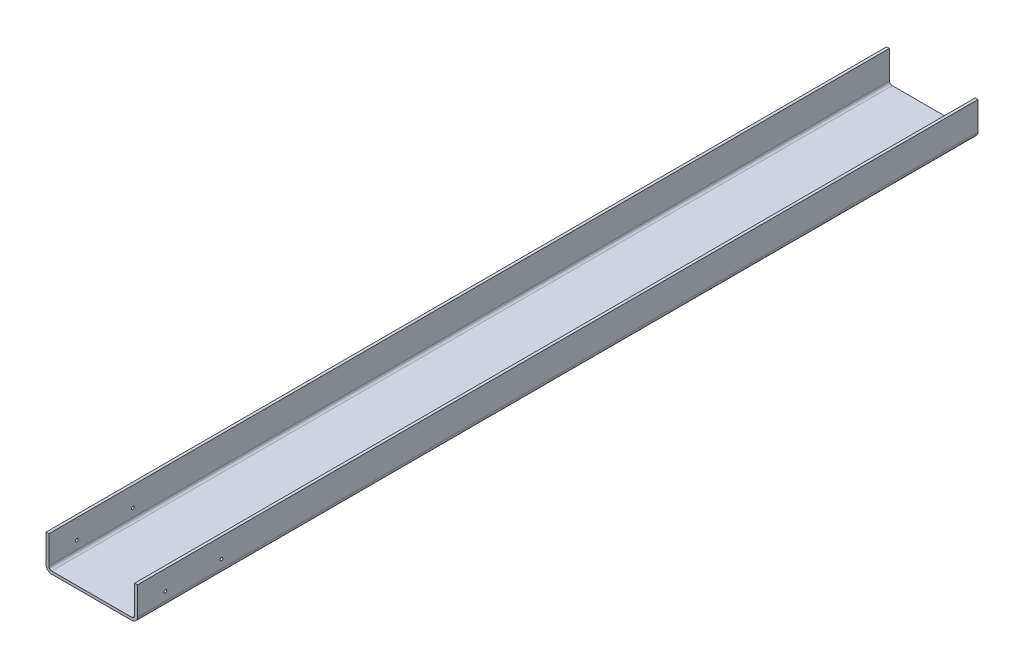
ISO-10303-21;
HEADER;
FILE_DESCRIPTION(('STEP AP214'),'2;1');
FILE_NAME('part.step','',(''),(''),'','','');
FILE_SCHEMA(('AUTOMOTIVE_DESIGN { 1 0 10303 214 1 1 1 1 }'));
ENDSEC;
DATA;
#1=APPLICATION_CONTEXT('core data for automotive mechanical design processes');
#2=APPLICATION_PROTOCOL_DEFINITION('international standard','automotive_design',2000,#1);
#3=PRODUCT_CONTEXT('',#1,'mechanical');
#4=PRODUCT('Part','Part','',(#3));
#5=PRODUCT_RELATED_PRODUCT_CATEGORY('part','',(#4));
#6=PRODUCT_DEFINITION_FORMATION('','',#4);
#7=PRODUCT_DEFINITION_CONTEXT('part definition',#1,'design');
#8=PRODUCT_DEFINITION('design','',#6,#7);
#9=PRODUCT_DEFINITION_SHAPE('','',#8);
#10=(LENGTH_UNIT() NAMED_UNIT(*) SI_UNIT(.MILLI.,.METRE.));
#11=(NAMED_UNIT(*) PLANE_ANGLE_UNIT() SI_UNIT($,.RADIAN.));
#12=(NAMED_UNIT(*) SI_UNIT($,.STERADIAN.) SOLID_ANGLE_UNIT());
#13=UNCERTAINTY_MEASURE_WITH_UNIT(LENGTH_MEASURE(1.E-05),#10,'distance_accuracy_value','');
#14=(GEOMETRIC_REPRESENTATION_CONTEXT(3) GLOBAL_UNCERTAINTY_ASSIGNED_CONTEXT((#13)) GLOBAL_UNIT_ASSIGNED_CONTEXT((#10,
#11,#12)) REPRESENTATION_CONTEXT('',''));
#15=CARTESIAN_POINT('',(0.,0.,0.));
#16=DIRECTION('',(0.,0.,1.));
#17=DIRECTION('',(1.,0.,0.));
#18=AXIS2_PLACEMENT_3D('',#15,#16,#17);
#19=CARTESIAN_POINT('',(81.5,9.99999999999998,750.));
#20=DIRECTION('',(-1.,0.,0.));
#21=DIRECTION('',(0.,0.,1.));
#22=AXIS2_PLACEMENT_3D('',#19,#20,#21);
#23=PLANE('',#22);
#24=DIRECTION('',(0.,1.,0.));
#25=VECTOR('',#24,1.);
#26=CARTESIAN_POINT('',(81.5,9.99999999999998,-750.));
#27=LINE('',#26,#25);
#28=CARTESIAN_POINT('',(81.5,9.99999999999998,-750.));
#29=VERTEX_POINT('',#28);
#30=CARTESIAN_POINT('',(81.5,60.,-750.));
#31=VERTEX_POINT('',#30);
#32=EDGE_CURVE('E109',#29,#31,#27,.T.);
#33=ORIENTED_EDGE('',*,*,#32,.T.);
#34=DIRECTION('',(0.,0.,-1.));
#35=VECTOR('',#34,1.);
#36=CARTESIAN_POINT('',(81.5,60.,750.));
#37=LINE('',#36,#35);
#38=CARTESIAN_POINT('',(81.5,60.,750.));
#39=VERTEX_POINT('',#38);
#40=EDGE_CURVE('E162',#39,#31,#37,.T.);
#41=ORIENTED_EDGE('',*,*,#40,.F.);
#42=DIRECTION('',(0.,1.,0.));
#43=VECTOR('',#42,1.);
#44=CARTESIAN_POINT('',(81.5,9.99999999999998,750.));
#45=LINE('',#44,#43);
#46=CARTESIAN_POINT('',(81.5,9.99999999999998,750.));
#47=VERTEX_POINT('',#46);
#48=EDGE_CURVE('E62',#47,#39,#45,.T.);
#49=ORIENTED_EDGE('',*,*,#48,.F.);
#50=DIRECTION('',(0.,0.,-1.));
#51=VECTOR('',#50,1.);
#52=CARTESIAN_POINT('',(81.5,9.99999999999998,750.));
#53=LINE('',#52,#51);
#54=EDGE_CURVE('E158',#47,#29,#53,.T.);
#55=ORIENTED_EDGE('',*,*,#54,.T.);
#56=EDGE_LOOP('',(#33,#41,#49,#55));
#57=FACE_BOUND('',#56,.T.);
#58=CARTESIAN_POINT('',(81.5,24.9115,700.));
#59=DIRECTION('',(1.,0.,0.));
#60=DIRECTION('',(0.,0.,-1.));
#61=AXIS2_PLACEMENT_3D('',#58,#59,#60);
#62=CIRCLE('',#61,2.5);
#63=CARTESIAN_POINT('',(81.5,24.9115,697.5));
#64=VERTEX_POINT('',#63);
#65=EDGE_CURVE('E262',#64,#64,#62,.T.);
#66=ORIENTED_EDGE('',*,*,#65,.F.);
#67=EDGE_LOOP('',(#66));
#68=FACE_BOUND('',#67,.T.);
#69=CARTESIAN_POINT('',(81.5,24.9115,600.));
#70=DIRECTION('',(1.,0.,0.));
#71=DIRECTION('',(0.,0.,-1.));
#72=AXIS2_PLACEMENT_3D('',#69,#70,#71);
#73=CIRCLE('',#72,2.5);
#74=CARTESIAN_POINT('',(81.5,24.9115,597.5));
#75=VERTEX_POINT('',#74);
#76=EDGE_CURVE('E265',#75,#75,#73,.T.);
#77=ORIENTED_EDGE('',*,*,#76,.F.);
#78=EDGE_LOOP('',(#77));
#79=FACE_BOUND('',#78,.T.);
#80=ADVANCED_FACE('F45',(#57,#68,#79),#23,.F.);
#81=CARTESIAN_POINT('',(76.5,60.,750.));
#82=DIRECTION('',(0.,-1.,0.));
#83=DIRECTION('',(0.,0.,-1.));
#84=AXIS2_PLACEMENT_3D('',#81,#82,#83);
#85=PLANE('',#84);
#86=DIRECTION('',(-1.,0.,0.));
#87=VECTOR('',#86,1.);
#88=CARTESIAN_POINT('',(76.5,60.,-750.));
#89=LINE('',#88,#87);
#90=CARTESIAN_POINT('',(76.5,60.,-750.));
#91=VERTEX_POINT('',#90);
#92=EDGE_CURVE('E166',#31,#91,#89,.T.);
#93=ORIENTED_EDGE('',*,*,#92,.T.);
#94=DIRECTION('',(0.,0.,-1.));
#95=VECTOR('',#94,1.);
#96=CARTESIAN_POINT('',(76.5,60.,750.));
#97=LINE('',#96,#95);
#98=CARTESIAN_POINT('',(76.5,60.,750.));
#99=VERTEX_POINT('',#98);
#100=EDGE_CURVE('E11',#99,#91,#97,.T.);
#101=ORIENTED_EDGE('',*,*,#100,.F.);
#102=DIRECTION('',(-1.,0.,0.));
#103=VECTOR('',#102,1.);
#104=CARTESIAN_POINT('',(76.5,60.,750.));
#105=LINE('',#104,#103);
#106=EDGE_CURVE('E189',#39,#99,#105,.T.);
#107=ORIENTED_EDGE('',*,*,#106,.F.);
#108=ORIENTED_EDGE('',*,*,#40,.T.);
#109=EDGE_LOOP('',(#93,#101,#107,#108));
#110=FACE_BOUND('',#109,.T.);
#111=ADVANCED_FACE('F47',(#110),#85,.F.);
#112=CARTESIAN_POINT('',(76.5,9.99999999999998,750.));
#113=DIRECTION('',(1.,0.,0.));
#114=DIRECTION('',(0.,0.,-1.));
#115=AXIS2_PLACEMENT_3D('',#112,#113,#114);
#116=PLANE('',#115);
#117=CARTESIAN_POINT('',(76.5,24.9115,600.));
#118=DIRECTION('',(1.,0.,0.));
#119=DIRECTION('',(0.,0.,-1.));
#120=AXIS2_PLACEMENT_3D('',#117,#118,#119);
#121=CIRCLE('',#120,2.49999999999998);
#122=CARTESIAN_POINT('',(76.5,24.9115,597.5));
#123=VERTEX_POINT('',#122);
#124=EDGE_CURVE('E270',#123,#123,#121,.T.);
#125=ORIENTED_EDGE('',*,*,#124,.T.);
#126=EDGE_LOOP('',(#125));
#127=FACE_BOUND('',#126,.T.);
#128=CARTESIAN_POINT('',(76.5,24.9115,700.));
#129=DIRECTION('',(1.,0.,0.));
#130=DIRECTION('',(0.,0.,-1.));
#131=AXIS2_PLACEMENT_3D('',#128,#129,#130);
#132=CIRCLE('',#131,2.49999999999998);
#133=CARTESIAN_POINT('',(76.5,24.9115,697.5));
#134=VERTEX_POINT('',#133);
#135=EDGE_CURVE('E282',#134,#134,#132,.T.);
#136=ORIENTED_EDGE('',*,*,#135,.T.);
#137=EDGE_LOOP('',(#136));
#138=FACE_BOUND('',#137,.T.);
#139=DIRECTION('',(0.,-1.,0.));
#140=VECTOR('',#139,1.);
#141=CARTESIAN_POINT('',(76.5,9.99999999999998,-750.));
#142=LINE('',#141,#140);
#143=CARTESIAN_POINT('',(76.5,9.99999999999998,-750.));
#144=VERTEX_POINT('',#143);
#145=EDGE_CURVE('E169',#91,#144,#142,.T.);
#146=ORIENTED_EDGE('',*,*,#145,.T.);
#147=DIRECTION('',(0.,0.,-1.));
#148=VECTOR('',#147,1.);
#149=CARTESIAN_POINT('',(76.5,9.99999999999998,750.));
#150=LINE('',#149,#148);
#151=CARTESIAN_POINT('',(76.5,9.99999999999998,750.));
#152=VERTEX_POINT('',#151);
#153=EDGE_CURVE('E54',#152,#144,#150,.T.);
#154=ORIENTED_EDGE('',*,*,#153,.F.);
#155=DIRECTION('',(0.,-1.,0.));
#156=VECTOR('',#155,1.);
#157=CARTESIAN_POINT('',(76.5,9.99999999999998,750.));
#158=LINE('',#157,#156);
#159=EDGE_CURVE('E117',#99,#152,#158,.T.);
#160=ORIENTED_EDGE('',*,*,#159,.F.);
#161=ORIENTED_EDGE('',*,*,#100,.T.);
#162=EDGE_LOOP('',(#146,#154,#160,#161));
#163=FACE_BOUND('',#162,.T.);
#164=ADVANCED_FACE('F335',(#127,#138,#163),#116,.F.);
#165=CARTESIAN_POINT('',(71.5,9.99999999999998,750.));
#166=DIRECTION('',(0.,0.,-1.));
#167=DIRECTION('',(-1.,0.,0.));
#168=AXIS2_PLACEMENT_3D('',#165,#166,#167);
#169=CYLINDRICAL_SURFACE('',#168,5.);
#170=CARTESIAN_POINT('',(71.5,9.99999999999998,-750.));
#171=DIRECTION('',(0.,0.,-1.));
#172=DIRECTION('',(-1.,0.,0.));
#173=AXIS2_PLACEMENT_3D('',#170,#171,#172);
#174=CIRCLE('',#173,5.);
#175=CARTESIAN_POINT('',(71.5,4.99999999999998,-750.));
#176=VERTEX_POINT('',#175);
#177=EDGE_CURVE('E172',#144,#176,#174,.T.);
#178=ORIENTED_EDGE('',*,*,#177,.T.);
#179=DIRECTION('',(0.,0.,-1.));
#180=VECTOR('',#179,1.);
#181=CARTESIAN_POINT('',(71.5,4.99999999999998,750.));
#182=LINE('',#181,#180);
#183=CARTESIAN_POINT('',(71.5,4.99999999999998,750.));
#184=VERTEX_POINT('',#183);
#185=EDGE_CURVE('E208',#184,#176,#182,.T.);
#186=ORIENTED_EDGE('',*,*,#185,.F.);
#187=CARTESIAN_POINT('',(71.5,9.99999999999998,750.));
#188=DIRECTION('',(0.,0.,-1.));
#189=DIRECTION('',(-1.,0.,0.));
#190=AXIS2_PLACEMENT_3D('',#187,#188,#189);
#191=CIRCLE('',#190,5.);
#192=EDGE_CURVE('E216',#152,#184,#191,.T.);
#193=ORIENTED_EDGE('',*,*,#192,.F.);
#194=ORIENTED_EDGE('',*,*,#153,.T.);
#195=EDGE_LOOP('',(#178,#186,#193,#194));
#196=FACE_BOUND('',#195,.T.);
#197=ADVANCED_FACE('F214',(#196),#169,.F.);
#198=CARTESIAN_POINT('',(71.5,4.99999999999998,750.));
#199=DIRECTION('',(0.,-1.,0.));
#200=DIRECTION('',(0.,0.,-1.));
#201=AXIS2_PLACEMENT_3D('',#198,#199,#200);
#202=PLANE('',#201);
#203=DIRECTION('',(-1.,0.,0.));
#204=VECTOR('',#203,1.);
#205=CARTESIAN_POINT('',(71.5,4.99999999999998,-750.));
#206=LINE('',#205,#204);
#207=CARTESIAN_POINT('',(-71.5,4.99999999999998,-750.));
#208=VERTEX_POINT('',#207);
#209=EDGE_CURVE('E174',#176,#208,#206,.T.);
#210=ORIENTED_EDGE('',*,*,#209,.T.);
#211=DIRECTION('',(0.,0.,-1.));
#212=VECTOR('',#211,1.);
#213=CARTESIAN_POINT('',(-71.5,4.99999999999998,750.));
#214=LINE('',#213,#212);
#215=CARTESIAN_POINT('',(-71.5,4.99999999999998,750.));
#216=VERTEX_POINT('',#215);
#217=EDGE_CURVE('E205',#216,#208,#214,.T.);
#218=ORIENTED_EDGE('',*,*,#217,.F.);
#219=DIRECTION('',(-1.,0.,0.));
#220=VECTOR('',#219,1.);
#221=CARTESIAN_POINT('',(71.5,4.99999999999998,750.));
#222=LINE('',#221,#220);
#223=EDGE_CURVE('E234',#184,#216,#222,.T.);
#224=ORIENTED_EDGE('',*,*,#223,.F.);
#225=ORIENTED_EDGE('',*,*,#185,.T.);
#226=EDGE_LOOP('',(#210,#218,#224,#225));
#227=FACE_BOUND('',#226,.T.);
#228=ADVANCED_FACE('F225',(#227),#202,.F.);
#229=CARTESIAN_POINT('',(-71.5,9.99999999999998,750.));
#230=DIRECTION('',(0.,0.,-1.));
#231=DIRECTION('',(-1.,0.,0.));
#232=AXIS2_PLACEMENT_3D('',#229,#230,#231);
#233=CYLINDRICAL_SURFACE('',#232,5.);
#234=CARTESIAN_POINT('',(-71.5,9.99999999999998,-750.));
#235=DIRECTION('',(0.,0.,-1.));
#236=DIRECTION('',(-1.,0.,0.));
#237=AXIS2_PLACEMENT_3D('',#234,#235,#236);
#238=CIRCLE('',#237,5.);
#239=CARTESIAN_POINT('',(-76.5,9.99999999999998,-750.));
#240=VERTEX_POINT('',#239);
#241=EDGE_CURVE('E176',#208,#240,#238,.T.);
#242=ORIENTED_EDGE('',*,*,#241,.T.);
#243=DIRECTION('',(0.,0.,-1.));
#244=VECTOR('',#243,1.);
#245=CARTESIAN_POINT('',(-76.5,9.99999999999998,750.));
#246=LINE('',#245,#244);
#247=CARTESIAN_POINT('',(-76.5,9.99999999999998,750.));
#248=VERTEX_POINT('',#247);
#249=EDGE_CURVE('E202',#248,#240,#246,.T.);
#250=ORIENTED_EDGE('',*,*,#249,.F.);
#251=CARTESIAN_POINT('',(-71.5,9.99999999999998,750.));
#252=DIRECTION('',(0.,0.,-1.));
#253=DIRECTION('',(-1.,0.,0.));
#254=AXIS2_PLACEMENT_3D('',#251,#252,#253);
#255=CIRCLE('',#254,5.);
#256=EDGE_CURVE('E231',#216,#248,#255,.T.);
#257=ORIENTED_EDGE('',*,*,#256,.F.);
#258=ORIENTED_EDGE('',*,*,#217,.T.);
#259=EDGE_LOOP('',(#242,#250,#257,#258));
#260=FACE_BOUND('',#259,.T.);
#261=ADVANCED_FACE('F229',(#260),#233,.F.);
#262=CARTESIAN_POINT('',(-76.5,9.99999999999998,750.));
#263=DIRECTION('',(-1.,0.,0.));
#264=DIRECTION('',(0.,0.,1.));
#265=AXIS2_PLACEMENT_3D('',#262,#263,#264);
#266=PLANE('',#265);
#267=CARTESIAN_POINT('',(-76.5,24.9115,600.));
#268=DIRECTION('',(-1.,0.,0.));
#269=DIRECTION('',(0.,0.,1.));
#270=AXIS2_PLACEMENT_3D('',#267,#268,#269);
#271=CIRCLE('',#270,2.49999999999998);
#272=CARTESIAN_POINT('',(-76.5,24.9115,602.5));
#273=VERTEX_POINT('',#272);
#274=EDGE_CURVE('E275',#273,#273,#271,.T.);
#275=ORIENTED_EDGE('',*,*,#274,.T.);
#276=EDGE_LOOP('',(#275));
#277=FACE_BOUND('',#276,.T.);
#278=CARTESIAN_POINT('',(-76.5,24.9115,700.));
#279=DIRECTION('',(-1.,0.,0.));
#280=DIRECTION('',(0.,0.,1.));
#281=AXIS2_PLACEMENT_3D('',#278,#279,#280);
#282=CIRCLE('',#281,2.49999999999998);
#283=CARTESIAN_POINT('',(-76.5,24.9115,702.5));
#284=VERTEX_POINT('',#283);
#285=EDGE_CURVE('E170',#284,#284,#282,.T.);
#286=ORIENTED_EDGE('',*,*,#285,.T.);
#287=EDGE_LOOP('',(#286));
#288=FACE_BOUND('',#287,.T.);
#289=DIRECTION('',(0.,1.,0.));
#290=VECTOR('',#289,1.);
#291=CARTESIAN_POINT('',(-76.5,9.99999999999998,-750.));
#292=LINE('',#291,#290);
#293=CARTESIAN_POINT('',(-76.5,60.,-750.));
#294=VERTEX_POINT('',#293);
#295=EDGE_CURVE('E178',#240,#294,#292,.T.);
#296=ORIENTED_EDGE('',*,*,#295,.T.);
#297=DIRECTION('',(0.,0.,-1.));
#298=VECTOR('',#297,1.);
#299=CARTESIAN_POINT('',(-76.5,60.,750.));
#300=LINE('',#299,#298);
#301=CARTESIAN_POINT('',(-76.5,60.,750.));
#302=VERTEX_POINT('',#301);
#303=EDGE_CURVE('E199',#302,#294,#300,.T.);
#304=ORIENTED_EDGE('',*,*,#303,.F.);
#305=DIRECTION('',(0.,1.,0.));
#306=VECTOR('',#305,1.);
#307=CARTESIAN_POINT('',(-76.5,9.99999999999998,750.));
#308=LINE('',#307,#306);
#309=EDGE_CURVE('E233',#248,#302,#308,.T.);
#310=ORIENTED_EDGE('',*,*,#309,.F.);
#311=ORIENTED_EDGE('',*,*,#249,.T.);
#312=EDGE_LOOP('',(#296,#304,#310,#311));
#313=FACE_BOUND('',#312,.T.);
#314=ADVANCED_FACE('F290',(#277,#288,#313),#266,.F.);
#315=CARTESIAN_POINT('',(-81.5,60.,750.));
#316=DIRECTION('',(0.,-1.,0.));
#317=DIRECTION('',(0.,0.,-1.));
#318=AXIS2_PLACEMENT_3D('',#315,#316,#317);
#319=PLANE('',#318);
#320=DIRECTION('',(-1.,0.,0.));
#321=VECTOR('',#320,1.);
#322=CARTESIAN_POINT('',(-81.5,60.,-750.));
#323=LINE('',#322,#321);
#324=CARTESIAN_POINT('',(-81.5,60.,-750.));
#325=VERTEX_POINT('',#324);
#326=EDGE_CURVE('E180',#294,#325,#323,.T.);
#327=ORIENTED_EDGE('',*,*,#326,.T.);
#328=DIRECTION('',(0.,0.,-1.));
#329=VECTOR('',#328,1.);
#330=CARTESIAN_POINT('',(-81.5,60.,750.));
#331=LINE('',#330,#329);
#332=CARTESIAN_POINT('',(-81.5,60.,750.));
#333=VERTEX_POINT('',#332);
#334=EDGE_CURVE('E196',#333,#325,#331,.T.);
#335=ORIENTED_EDGE('',*,*,#334,.F.);
#336=DIRECTION('',(-1.,0.,0.));
#337=VECTOR('',#336,1.);
#338=CARTESIAN_POINT('',(-81.5,60.,750.));
#339=LINE('',#338,#337);
#340=EDGE_CURVE('E236',#302,#333,#339,.T.);
#341=ORIENTED_EDGE('',*,*,#340,.F.);
#342=ORIENTED_EDGE('',*,*,#303,.T.);
#343=EDGE_LOOP('',(#327,#335,#341,#342));
#344=FACE_BOUND('',#343,.T.);
#345=ADVANCED_FACE('F322',(#344),#319,.F.);
#346=CARTESIAN_POINT('',(-81.5,9.99999999999998,750.));
#347=DIRECTION('',(1.,0.,0.));
#348=DIRECTION('',(0.,0.,-1.));
#349=AXIS2_PLACEMENT_3D('',#346,#347,#348);
#350=PLANE('',#349);
#351=CARTESIAN_POINT('',(-81.5,24.9115,600.));
#352=DIRECTION('',(1.,0.,0.));
#353=DIRECTION('',(0.,0.,-1.));
#354=AXIS2_PLACEMENT_3D('',#351,#352,#353);
#355=CIRCLE('',#354,2.49999999999996);
#356=CARTESIAN_POINT('',(-81.5,24.9115,597.5));
#357=VERTEX_POINT('',#356);
#358=EDGE_CURVE('E267',#357,#357,#355,.T.);
#359=ORIENTED_EDGE('',*,*,#358,.T.);
#360=EDGE_LOOP('',(#359));
#361=FACE_BOUND('',#360,.T.);
#362=CARTESIAN_POINT('',(-81.5,24.9115,700.));
#363=DIRECTION('',(1.,0.,0.));
#364=DIRECTION('',(0.,0.,-1.));
#365=AXIS2_PLACEMENT_3D('',#362,#363,#364);
#366=CIRCLE('',#365,2.49999999999996);
#367=CARTESIAN_POINT('',(-81.5,24.9115,697.5));
#368=VERTEX_POINT('',#367);
#369=EDGE_CURVE('E279',#368,#368,#366,.T.);
#370=ORIENTED_EDGE('',*,*,#369,.T.);
#371=EDGE_LOOP('',(#370));
#372=FACE_BOUND('',#371,.T.);
#373=DIRECTION('',(0.,-1.,0.));
#374=VECTOR('',#373,1.);
#375=CARTESIAN_POINT('',(-81.5,9.99999999999998,-750.));
#376=LINE('',#375,#374);
#377=CARTESIAN_POINT('',(-81.5,9.99999999999998,-750.));
#378=VERTEX_POINT('',#377);
#379=EDGE_CURVE('E182',#325,#378,#376,.T.);
#380=ORIENTED_EDGE('',*,*,#379,.T.);
#381=DIRECTION('',(0.,0.,-1.));
#382=VECTOR('',#381,1.);
#383=CARTESIAN_POINT('',(-81.5,9.99999999999998,750.));
#384=LINE('',#383,#382);
#385=CARTESIAN_POINT('',(-81.5,9.99999999999998,750.));
#386=VERTEX_POINT('',#385);
#387=EDGE_CURVE('E193',#386,#378,#384,.T.);
#388=ORIENTED_EDGE('',*,*,#387,.F.);
#389=DIRECTION('',(0.,-1.,0.));
#390=VECTOR('',#389,1.);
#391=CARTESIAN_POINT('',(-81.5,9.99999999999998,750.));
#392=LINE('',#391,#390);
#393=EDGE_CURVE('E242',#333,#386,#392,.T.);
#394=ORIENTED_EDGE('',*,*,#393,.F.);
#395=ORIENTED_EDGE('',*,*,#334,.T.);
#396=EDGE_LOOP('',(#380,#388,#394,#395));
#397=FACE_BOUND('',#396,.T.);
#398=ADVANCED_FACE('F248',(#361,#372,#397),#350,.F.);
#399=CARTESIAN_POINT('',(-71.5,9.99999999999998,750.));
#400=DIRECTION('',(0.,0.,-1.));
#401=DIRECTION('',(-1.,0.,0.));
#402=AXIS2_PLACEMENT_3D('',#399,#400,#401);
#403=CYLINDRICAL_SURFACE('',#402,9.99999999999999);
#404=CARTESIAN_POINT('',(-71.5,9.99999999999998,-750.));
#405=DIRECTION('',(0.,0.,1.));
#406=DIRECTION('',(-1.,0.,0.));
#407=AXIS2_PLACEMENT_3D('',#404,#405,#406);
#408=CIRCLE('',#407,9.99999999999999);
#409=CARTESIAN_POINT('',(-71.5,0.,-750.));
#410=VERTEX_POINT('',#409);
#411=EDGE_CURVE('E184',#378,#410,#408,.T.);
#412=ORIENTED_EDGE('',*,*,#411,.T.);
#413=DIRECTION('',(0.,0.,-1.));
#414=VECTOR('',#413,1.);
#415=CARTESIAN_POINT('',(-71.5,0.,750.));
#416=LINE('',#415,#414);
#417=CARTESIAN_POINT('',(-71.5,0.,750.));
#418=VERTEX_POINT('',#417);
#419=EDGE_CURVE('E157',#418,#410,#416,.T.);
#420=ORIENTED_EDGE('',*,*,#419,.F.);
#421=CARTESIAN_POINT('',(-71.5,9.99999999999998,750.));
#422=DIRECTION('',(0.,0.,1.));
#423=DIRECTION('',(-1.,0.,0.));
#424=AXIS2_PLACEMENT_3D('',#421,#422,#423);
#425=CIRCLE('',#424,9.99999999999999);
#426=EDGE_CURVE('E148',#386,#418,#425,.T.);
#427=ORIENTED_EDGE('',*,*,#426,.F.);
#428=ORIENTED_EDGE('',*,*,#387,.T.);
#429=EDGE_LOOP('',(#412,#420,#427,#428));
#430=FACE_BOUND('',#429,.T.);
#431=ADVANCED_FACE('F252',(#430),#403,.T.);
#432=CARTESIAN_POINT('',(71.5,0.,750.));
#433=DIRECTION('',(0.,1.,0.));
#434=DIRECTION('',(0.,0.,1.));
#435=AXIS2_PLACEMENT_3D('',#432,#433,#434);
#436=PLANE('',#435);
#437=DIRECTION('',(1.,0.,0.));
#438=VECTOR('',#437,1.);
#439=CARTESIAN_POINT('',(71.5,0.,-750.));
#440=LINE('',#439,#438);
#441=CARTESIAN_POINT('',(71.5,0.,-750.));
#442=VERTEX_POINT('',#441);
#443=EDGE_CURVE('E156',#410,#442,#440,.T.);
#444=ORIENTED_EDGE('',*,*,#443,.T.);
#445=DIRECTION('',(0.,0.,-1.));
#446=VECTOR('',#445,1.);
#447=CARTESIAN_POINT('',(71.5,0.,750.));
#448=LINE('',#447,#446);
#449=CARTESIAN_POINT('',(71.5,0.,750.));
#450=VERTEX_POINT('',#449);
#451=EDGE_CURVE('E153',#450,#442,#448,.T.);
#452=ORIENTED_EDGE('',*,*,#451,.F.);
#453=DIRECTION('',(1.,0.,0.));
#454=VECTOR('',#453,1.);
#455=CARTESIAN_POINT('',(71.5,0.,750.));
#456=LINE('',#455,#454);
#457=EDGE_CURVE('E142',#418,#450,#456,.T.);
#458=ORIENTED_EDGE('',*,*,#457,.F.);
#459=ORIENTED_EDGE('',*,*,#419,.T.);
#460=EDGE_LOOP('',(#444,#452,#458,#459));
#461=FACE_BOUND('',#460,.T.);
#462=ADVANCED_FACE('F154',(#461),#436,.F.);
#463=CARTESIAN_POINT('',(71.5,9.99999999999998,750.));
#464=DIRECTION('',(0.,0.,-1.));
#465=DIRECTION('',(-1.,0.,0.));
#466=AXIS2_PLACEMENT_3D('',#463,#464,#465);
#467=CYLINDRICAL_SURFACE('',#466,9.99999999999999);
#468=CARTESIAN_POINT('',(71.5,9.99999999999998,-750.));
#469=DIRECTION('',(0.,0.,1.));
#470=DIRECTION('',(-1.,0.,0.));
#471=AXIS2_PLACEMENT_3D('',#468,#469,#470);
#472=CIRCLE('',#471,9.99999999999999);
#473=EDGE_CURVE('E103',#442,#29,#472,.T.);
#474=ORIENTED_EDGE('',*,*,#473,.T.);
#475=ORIENTED_EDGE('',*,*,#54,.F.);
#476=CARTESIAN_POINT('',(71.5,9.99999999999998,750.));
#477=DIRECTION('',(0.,0.,1.));
#478=DIRECTION('',(-1.,0.,0.));
#479=AXIS2_PLACEMENT_3D('',#476,#477,#478);
#480=CIRCLE('',#479,9.99999999999999);
#481=EDGE_CURVE('E146',#450,#47,#480,.T.);
#482=ORIENTED_EDGE('',*,*,#481,.F.);
#483=ORIENTED_EDGE('',*,*,#451,.T.);
#484=EDGE_LOOP('',(#474,#475,#482,#483));
#485=FACE_BOUND('',#484,.T.);
#486=ADVANCED_FACE('F160',(#485),#467,.T.);
#487=CARTESIAN_POINT('',(71.5,9.99999999999998,750.));
#488=DIRECTION('',(0.,0.,-1.));
#489=DIRECTION('',(-1.,0.,0.));
#490=AXIS2_PLACEMENT_3D('',#487,#488,#489);
#491=PLANE('',#490);
#492=ORIENTED_EDGE('',*,*,#106,.T.);
#493=ORIENTED_EDGE('',*,*,#159,.T.);
#494=ORIENTED_EDGE('',*,*,#192,.T.);
#495=ORIENTED_EDGE('',*,*,#223,.T.);
#496=ORIENTED_EDGE('',*,*,#256,.T.);
#497=ORIENTED_EDGE('',*,*,#309,.T.);
#498=ORIENTED_EDGE('',*,*,#340,.T.);
#499=ORIENTED_EDGE('',*,*,#393,.T.);
#500=ORIENTED_EDGE('',*,*,#426,.T.);
#501=ORIENTED_EDGE('',*,*,#457,.T.);
#502=ORIENTED_EDGE('',*,*,#481,.T.);
#503=ORIENTED_EDGE('',*,*,#48,.T.);
#504=EDGE_LOOP('',(#492,#493,#494,#495,#496,#497,#498,#499,#500,#501,#502,#503));
#505=FACE_BOUND('',#504,.T.);
#506=ADVANCED_FACE('F144',(#505),#491,.F.);
#507=CARTESIAN_POINT('',(71.5,9.99999999999998,-750.));
#508=DIRECTION('',(0.,0.,-1.));
#509=DIRECTION('',(-1.,0.,0.));
#510=AXIS2_PLACEMENT_3D('',#507,#508,#509);
#511=PLANE('',#510);
#512=ORIENTED_EDGE('',*,*,#92,.F.);
#513=ORIENTED_EDGE('',*,*,#32,.F.);
#514=ORIENTED_EDGE('',*,*,#473,.F.);
#515=ORIENTED_EDGE('',*,*,#443,.F.);
#516=ORIENTED_EDGE('',*,*,#411,.F.);
#517=ORIENTED_EDGE('',*,*,#379,.F.);
#518=ORIENTED_EDGE('',*,*,#326,.F.);
#519=ORIENTED_EDGE('',*,*,#295,.F.);
#520=ORIENTED_EDGE('',*,*,#241,.F.);
#521=ORIENTED_EDGE('',*,*,#209,.F.);
#522=ORIENTED_EDGE('',*,*,#177,.F.);
#523=ORIENTED_EDGE('',*,*,#145,.F.);
#524=EDGE_LOOP('',(#512,#513,#514,#515,#516,#517,#518,#519,#520,#521,#522,#523));
#525=FACE_BOUND('',#524,.T.);
#526=ADVANCED_FACE('F220',(#525),#511,.T.);
#527=CARTESIAN_POINT('',(81.5,24.9115,700.));
#528=DIRECTION('',(1.,0.,0.));
#529=DIRECTION('',(0.,0.,-1.));
#530=AXIS2_PLACEMENT_3D('',#527,#528,#529);
#531=CYLINDRICAL_SURFACE('',#530,2.49999999999998);
#532=ORIENTED_EDGE('',*,*,#65,.T.);
#533=EDGE_LOOP('',(#532));
#534=FACE_BOUND('',#533,.T.);
#535=ORIENTED_EDGE('',*,*,#135,.F.);
#536=EDGE_LOOP('',(#535));
#537=FACE_BOUND('',#536,.T.);
#538=ADVANCED_FACE('F296',(#534,#537),#531,.F.);
#539=ORIENTED_EDGE('',*,*,#369,.F.);
#540=EDGE_LOOP('',(#539));
#541=FACE_BOUND('',#540,.T.);
#542=ORIENTED_EDGE('',*,*,#285,.F.);
#543=EDGE_LOOP('',(#542));
#544=FACE_BOUND('',#543,.T.);
#545=ADVANCED_FACE('F293',(#541,#544),#531,.F.);
#546=CARTESIAN_POINT('',(81.5,24.9115,600.));
#547=DIRECTION('',(1.,0.,0.));
#548=DIRECTION('',(0.,0.,-1.));
#549=AXIS2_PLACEMENT_3D('',#546,#547,#548);
#550=CYLINDRICAL_SURFACE('',#549,2.49999999999998);
#551=ORIENTED_EDGE('',*,*,#76,.T.);
#552=EDGE_LOOP('',(#551));
#553=FACE_BOUND('',#552,.T.);
#554=ORIENTED_EDGE('',*,*,#124,.F.);
#555=EDGE_LOOP('',(#554));
#556=FACE_BOUND('',#555,.T.);
#557=ADVANCED_FACE('F295',(#553,#556),#550,.F.);
#558=ORIENTED_EDGE('',*,*,#358,.F.);
#559=EDGE_LOOP('',(#558));
#560=FACE_BOUND('',#559,.T.);
#561=ORIENTED_EDGE('',*,*,#274,.F.);
#562=EDGE_LOOP('',(#561));
#563=FACE_BOUND('',#562,.T.);
#564=ADVANCED_FACE('F304',(#560,#563),#550,.F.);
#565=CLOSED_SHELL('',(#80,#111,#164,#197,#228,#261,#314,#345,#398,#431,#462,#486,#506,#526,#538,
#545,#557,#564));
#566=MANIFOLD_SOLID_BREP('B2',#565);
#567=ADVANCED_BREP_SHAPE_REPRESENTATION('',(#18,#566),#14);
#568=SHAPE_DEFINITION_REPRESENTATION(#9,#567);
ENDSEC;
END-ISO-10303-21;
